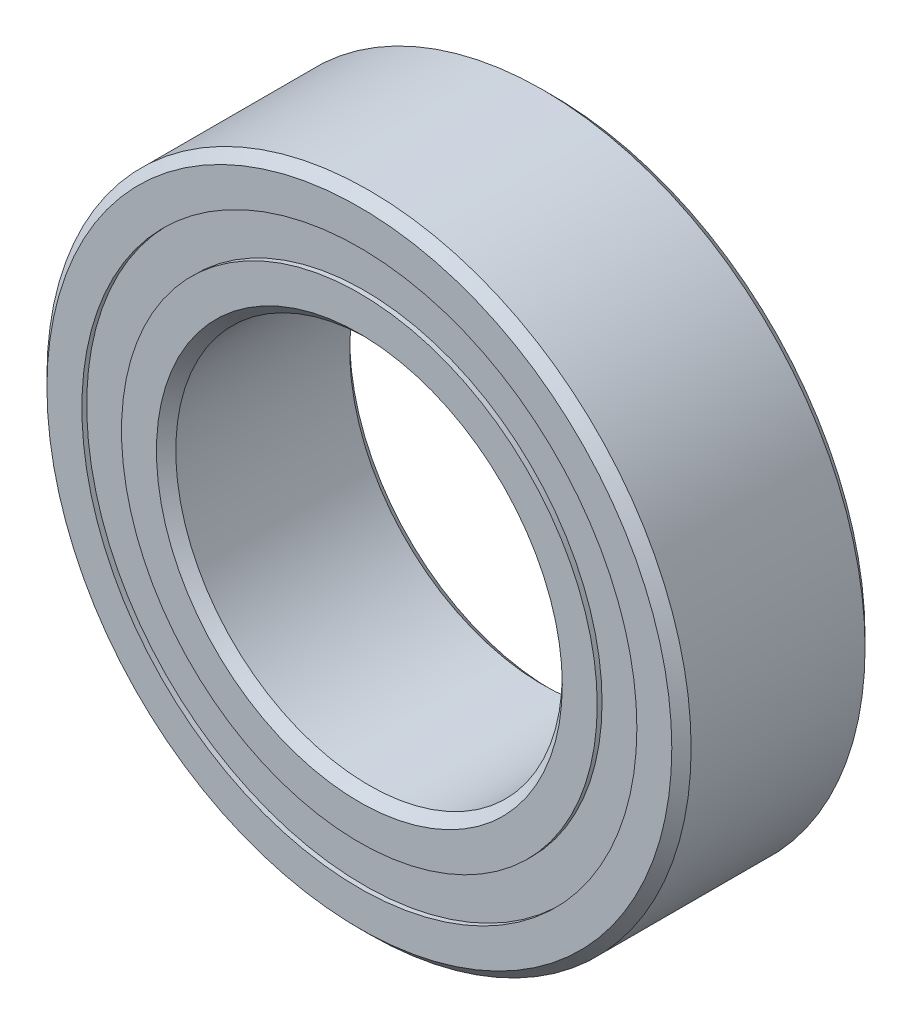
ISO-10303-21;
HEADER;
FILE_DESCRIPTION(('STEP AP214'),'2;1');
FILE_NAME('part.step','',(''),(''),'','','');
FILE_SCHEMA(('AUTOMOTIVE_DESIGN { 1 0 10303 214 1 1 1 1 }'));
ENDSEC;
DATA;
#1=APPLICATION_CONTEXT('core data for automotive mechanical design processes');
#2=APPLICATION_PROTOCOL_DEFINITION('international standard','automotive_design',2000,#1);
#3=PRODUCT_CONTEXT('',#1,'mechanical');
#4=PRODUCT('Part','Part','',(#3));
#5=PRODUCT_RELATED_PRODUCT_CATEGORY('part','',(#4));
#6=PRODUCT_DEFINITION_FORMATION('','',#4);
#7=PRODUCT_DEFINITION_CONTEXT('part definition',#1,'design');
#8=PRODUCT_DEFINITION('design','',#6,#7);
#9=PRODUCT_DEFINITION_SHAPE('','',#8);
#10=(LENGTH_UNIT() NAMED_UNIT(*) SI_UNIT(.MILLI.,.METRE.));
#11=(NAMED_UNIT(*) PLANE_ANGLE_UNIT() SI_UNIT($,.RADIAN.));
#12=(NAMED_UNIT(*) SI_UNIT($,.STERADIAN.) SOLID_ANGLE_UNIT());
#13=UNCERTAINTY_MEASURE_WITH_UNIT(LENGTH_MEASURE(1.E-05),#10,'distance_accuracy_value','');
#14=(GEOMETRIC_REPRESENTATION_CONTEXT(3) GLOBAL_UNCERTAINTY_ASSIGNED_CONTEXT((#13)) GLOBAL_UNIT_ASSIGNED_CONTEXT((#10,
#11,#12)) REPRESENTATION_CONTEXT('',''));
#15=CARTESIAN_POINT('',(0.,0.,0.));
#16=DIRECTION('',(0.,0.,1.));
#17=DIRECTION('',(1.,0.,0.));
#18=AXIS2_PLACEMENT_3D('',#15,#16,#17);
#19=CARTESIAN_POINT('',(0.,4.30769230769231,-1.425));
#20=DIRECTION('',(0.,0.,1.));
#21=DIRECTION('',(1.,0.,0.));
#22=AXIS2_PLACEMENT_3D('',#19,#20,#21);
#23=PLANE('',#22);
#24=CARTESIAN_POINT('',(0.,0.,-1.425));
#25=DIRECTION('',(0.,0.,1.));
#26=DIRECTION('',(1.,0.,0.));
#27=AXIS2_PLACEMENT_3D('',#24,#25,#26);
#28=CIRCLE('',#27,4.30769230769231);
#29=CARTESIAN_POINT('',(4.30769230769231,0.,-1.425));
#30=VERTEX_POINT('',#29);
#31=EDGE_CURVE('E57',#30,#30,#28,.T.);
#32=ORIENTED_EDGE('',*,*,#31,.F.);
#33=EDGE_LOOP('',(#32));
#34=FACE_BOUND('',#33,.T.);
#35=CARTESIAN_POINT('',(0.,0.,-1.425));
#36=DIRECTION('',(0.,0.,1.));
#37=DIRECTION('',(1.,0.,0.));
#38=AXIS2_PLACEMENT_3D('',#35,#36,#37);
#39=CIRCLE('',#38,3.69230769230769);
#40=CARTESIAN_POINT('',(3.69230769230769,0.,-1.425));
#41=VERTEX_POINT('',#40);
#42=EDGE_CURVE('E11',#41,#41,#39,.T.);
#43=ORIENTED_EDGE('',*,*,#42,.T.);
#44=EDGE_LOOP('',(#43));
#45=FACE_BOUND('',#44,.T.);
#46=ADVANCED_FACE('F43',(#34,#45),#23,.F.);
#47=CARTESIAN_POINT('',(0.,0.,1.5));
#48=DIRECTION('',(0.,0.,1.));
#49=DIRECTION('',(1.,0.,0.));
#50=AXIS2_PLACEMENT_3D('',#47,#48,#49);
#51=CYLINDRICAL_SURFACE('',#50,3.69230769230769);
#52=ORIENTED_EDGE('',*,*,#42,.F.);
#53=EDGE_LOOP('',(#52));
#54=FACE_BOUND('',#53,.T.);
#55=CARTESIAN_POINT('',(0.,0.,-0.734247234014172));
#56=DIRECTION('',(0.,0.,1.));
#57=DIRECTION('',(1.,0.,0.));
#58=AXIS2_PLACEMENT_3D('',#55,#56,#57);
#59=CIRCLE('',#58,3.69230769230769);
#60=CARTESIAN_POINT('',(3.69230769230769,0.,-0.734247234014172));
#61=VERTEX_POINT('',#60);
#62=EDGE_CURVE('E49',#61,#61,#59,.T.);
#63=ORIENTED_EDGE('',*,*,#62,.T.);
#64=EDGE_LOOP('',(#63));
#65=FACE_BOUND('',#64,.T.);
#66=ADVANCED_FACE('F66',(#54,#65),#51,.F.);
#67=CARTESIAN_POINT('',(0.,4.30769230769231,-0.734247234014172));
#68=DIRECTION('',(0.,0.,-1.));
#69=DIRECTION('',(-1.,0.,0.));
#70=AXIS2_PLACEMENT_3D('',#67,#68,#69);
#71=PLANE('',#70);
#72=ORIENTED_EDGE('',*,*,#62,.F.);
#73=EDGE_LOOP('',(#72));
#74=FACE_BOUND('',#73,.T.);
#75=CARTESIAN_POINT('',(0.,0.,-0.734247234014172));
#76=DIRECTION('',(0.,0.,1.));
#77=DIRECTION('',(1.,0.,0.));
#78=AXIS2_PLACEMENT_3D('',#75,#76,#77);
#79=CIRCLE('',#78,4.30769230769231);
#80=CARTESIAN_POINT('',(4.30769230769231,0.,-0.734247234014172));
#81=VERTEX_POINT('',#80);
#82=EDGE_CURVE('E53',#81,#81,#79,.T.);
#83=ORIENTED_EDGE('',*,*,#82,.T.);
#84=EDGE_LOOP('',(#83));
#85=FACE_BOUND('',#84,.T.);
#86=ADVANCED_FACE('F70',(#74,#85),#71,.F.);
#87=CARTESIAN_POINT('',(0.,0.,1.5));
#88=DIRECTION('',(0.,0.,1.));
#89=DIRECTION('',(1.,0.,0.));
#90=AXIS2_PLACEMENT_3D('',#87,#88,#89);
#91=CYLINDRICAL_SURFACE('',#90,4.30769230769231);
#92=ORIENTED_EDGE('',*,*,#82,.F.);
#93=EDGE_LOOP('',(#92));
#94=FACE_BOUND('',#93,.T.);
#95=ORIENTED_EDGE('',*,*,#31,.T.);
#96=EDGE_LOOP('',(#95));
#97=FACE_BOUND('',#96,.T.);
#98=ADVANCED_FACE('F63',(#94,#97),#91,.T.);
#99=CLOSED_SHELL('',(#46,#66,#86,#98));
#100=MANIFOLD_SOLID_BREP('B2',#99);
#101=CARTESIAN_POINT('',(0.,4.30769230769231,1.425));
#102=DIRECTION('',(0.,0.,-1.));
#103=DIRECTION('',(-1.,0.,0.));
#104=AXIS2_PLACEMENT_3D('',#101,#102,#103);
#105=PLANE('',#104);
#106=CARTESIAN_POINT('',(0.,0.,1.425));
#107=DIRECTION('',(0.,0.,1.));
#108=DIRECTION('',(1.,0.,0.));
#109=AXIS2_PLACEMENT_3D('',#106,#107,#108);
#110=CIRCLE('',#109,3.69230769230769);
#111=CARTESIAN_POINT('',(3.69230769230769,0.,1.425));
#112=VERTEX_POINT('',#111);
#113=EDGE_CURVE('E42',#112,#112,#110,.T.);
#114=ORIENTED_EDGE('',*,*,#113,.F.);
#115=EDGE_LOOP('',(#114));
#116=FACE_BOUND('',#115,.T.);
#117=CARTESIAN_POINT('',(0.,0.,1.425));
#118=DIRECTION('',(0.,0.,1.));
#119=DIRECTION('',(1.,0.,0.));
#120=AXIS2_PLACEMENT_3D('',#117,#118,#119);
#121=CIRCLE('',#120,4.30769230769231);
#122=CARTESIAN_POINT('',(4.30769230769231,0.,1.425));
#123=VERTEX_POINT('',#122);
#124=EDGE_CURVE('E124',#123,#123,#121,.T.);
#125=ORIENTED_EDGE('',*,*,#124,.T.);
#126=EDGE_LOOP('',(#125));
#127=FACE_BOUND('',#126,.T.);
#128=ADVANCED_FACE('F110',(#116,#127),#105,.F.);
#129=CARTESIAN_POINT('',(0.,0.,1.5));
#130=DIRECTION('',(0.,0.,1.));
#131=DIRECTION('',(1.,0.,0.));
#132=AXIS2_PLACEMENT_3D('',#129,#130,#131);
#133=CYLINDRICAL_SURFACE('',#132,3.69230769230769);
#134=CARTESIAN_POINT('',(0.,0.,0.734247234014171));
#135=DIRECTION('',(0.,0.,1.));
#136=DIRECTION('',(1.,0.,0.));
#137=AXIS2_PLACEMENT_3D('',#134,#135,#136);
#138=CIRCLE('',#137,3.69230769230769);
#139=CARTESIAN_POINT('',(3.69230769230769,0.,0.734247234014171));
#140=VERTEX_POINT('',#139);
#141=EDGE_CURVE('E116',#140,#140,#138,.T.);
#142=ORIENTED_EDGE('',*,*,#141,.F.);
#143=EDGE_LOOP('',(#142));
#144=FACE_BOUND('',#143,.T.);
#145=ORIENTED_EDGE('',*,*,#113,.T.);
#146=EDGE_LOOP('',(#145));
#147=FACE_BOUND('',#146,.T.);
#148=ADVANCED_FACE('F139',(#144,#147),#133,.F.);
#149=CARTESIAN_POINT('',(0.,4.30769230769231,0.734247234014171));
#150=DIRECTION('',(0.,0.,1.));
#151=DIRECTION('',(1.,0.,0.));
#152=AXIS2_PLACEMENT_3D('',#149,#150,#151);
#153=PLANE('',#152);
#154=CARTESIAN_POINT('',(0.,0.,0.734247234014171));
#155=DIRECTION('',(0.,0.,1.));
#156=DIRECTION('',(1.,0.,0.));
#157=AXIS2_PLACEMENT_3D('',#154,#155,#156);
#158=CIRCLE('',#157,4.30769230769231);
#159=CARTESIAN_POINT('',(4.30769230769231,0.,0.734247234014171));
#160=VERTEX_POINT('',#159);
#161=EDGE_CURVE('E120',#160,#160,#158,.T.);
#162=ORIENTED_EDGE('',*,*,#161,.F.);
#163=EDGE_LOOP('',(#162));
#164=FACE_BOUND('',#163,.T.);
#165=ORIENTED_EDGE('',*,*,#141,.T.);
#166=EDGE_LOOP('',(#165));
#167=FACE_BOUND('',#166,.T.);
#168=ADVANCED_FACE('F134',(#164,#167),#153,.F.);
#169=CARTESIAN_POINT('',(0.,0.,1.5));
#170=DIRECTION('',(0.,0.,1.));
#171=DIRECTION('',(1.,0.,0.));
#172=AXIS2_PLACEMENT_3D('',#169,#170,#171);
#173=CYLINDRICAL_SURFACE('',#172,4.30769230769231);
#174=ORIENTED_EDGE('',*,*,#124,.F.);
#175=EDGE_LOOP('',(#174));
#176=FACE_BOUND('',#175,.T.);
#177=ORIENTED_EDGE('',*,*,#161,.T.);
#178=EDGE_LOOP('',(#177));
#179=FACE_BOUND('',#178,.T.);
#180=ADVANCED_FACE('F131',(#176,#179),#173,.T.);
#181=CLOSED_SHELL('',(#128,#148,#168,#180));
#182=MANIFOLD_SOLID_BREP('B6',#181);
#183=CARTESIAN_POINT('',(-1.99999999999996,3.46410161513778,0.));
#184=DIRECTION('',(0.,0.,1.));
#185=DIRECTION('',(-0.499999999999989,0.866025403784445,0.));
#186=AXIS2_PLACEMENT_3D('',#183,#184,#185);
#187=SPHERICAL_SURFACE('',#186,0.734247234014171);
#188=CARTESIAN_POINT('',(-1.99999999999996,3.46410161513778,0.734247234014171));
#189=VERTEX_POINT('',#188);
#190=VERTEX_LOOP('',#189);
#191=FACE_BOUND('',#190,.T.);
#192=ADVANCED_FACE('F177',(#191),#187,.T.);
#193=CLOSED_SHELL('',(#192));
#194=MANIFOLD_SOLID_BREP('B37',#193);
#195=CARTESIAN_POINT('',(-3.46410161513773,2.00000000000004,0.));
#196=DIRECTION('',(0.,0.,1.));
#197=DIRECTION('',(-0.866025403784433,0.50000000000001,0.));
#198=AXIS2_PLACEMENT_3D('',#195,#196,#197);
#199=SPHERICAL_SURFACE('',#198,0.734247234014171);
#200=CARTESIAN_POINT('',(-3.46410161513773,2.00000000000004,0.734247234014171));
#201=VERTEX_POINT('',#200);
#202=VERTEX_LOOP('',#201);
#203=FACE_BOUND('',#202,.T.);
#204=ADVANCED_FACE('F197',(#203),#199,.T.);
#205=CLOSED_SHELL('',(#204));
#206=MANIFOLD_SOLID_BREP('B106',#205);
#207=CARTESIAN_POINT('',(-4.,0.,0.));
#208=DIRECTION('',(0.,0.,1.));
#209=DIRECTION('',(-1.,0.,0.));
#210=AXIS2_PLACEMENT_3D('',#207,#208,#209);
#211=SPHERICAL_SURFACE('',#210,0.734247234014171);
#212=CARTESIAN_POINT('',(-4.,0.,0.734247234014171));
#213=VERTEX_POINT('',#212);
#214=VERTEX_LOOP('',#213);
#215=FACE_BOUND('',#214,.T.);
#216=ADVANCED_FACE('F217',(#215),#211,.T.);
#217=CLOSED_SHELL('',(#216));
#218=MANIFOLD_SOLID_BREP('B173',#217);
#219=CARTESIAN_POINT('',(-3.46410161513777,-1.99999999999997,0.));
#220=DIRECTION('',(0.,0.,1.));
#221=DIRECTION('',(-0.866025403784443,-0.499999999999992,0.));
#222=AXIS2_PLACEMENT_3D('',#219,#220,#221);
#223=SPHERICAL_SURFACE('',#222,0.734247234014171);
#224=CARTESIAN_POINT('',(-3.46410161513777,-1.99999999999997,0.734247234014171));
#225=VERTEX_POINT('',#224);
#226=VERTEX_LOOP('',#225);
#227=FACE_BOUND('',#226,.T.);
#228=ADVANCED_FACE('F237',(#227),#223,.T.);
#229=CLOSED_SHELL('',(#228));
#230=MANIFOLD_SOLID_BREP('B193',#229);
#231=CARTESIAN_POINT('',(-2.00000000000003,-3.46410161513774,0.));
#232=DIRECTION('',(0.,0.,1.));
#233=DIRECTION('',(-0.500000000000007,-0.866025403784435,0.));
#234=AXIS2_PLACEMENT_3D('',#231,#232,#233);
#235=SPHERICAL_SURFACE('',#234,0.734247234014171);
#236=CARTESIAN_POINT('',(-2.00000000000003,-3.46410161513774,0.734247234014171));
#237=VERTEX_POINT('',#236);
#238=VERTEX_LOOP('',#237);
#239=FACE_BOUND('',#238,.T.);
#240=ADVANCED_FACE('F257',(#239),#235,.T.);
#241=CLOSED_SHELL('',(#240));
#242=MANIFOLD_SOLID_BREP('B213',#241);
#243=CARTESIAN_POINT('',(0.,-4.,0.));
#244=DIRECTION('',(0.,0.,1.));
#245=DIRECTION('',(0.,-1.,0.));
#246=AXIS2_PLACEMENT_3D('',#243,#244,#245);
#247=SPHERICAL_SURFACE('',#246,0.734247234014171);
#248=CARTESIAN_POINT('',(0.,-4.,0.734247234014171));
#249=VERTEX_POINT('',#248);
#250=VERTEX_LOOP('',#249);
#251=FACE_BOUND('',#250,.T.);
#252=ADVANCED_FACE('F277',(#251),#247,.T.);
#253=CLOSED_SHELL('',(#252));
#254=MANIFOLD_SOLID_BREP('B233',#253);
#255=CARTESIAN_POINT('',(1.99999999999998,-3.46410161513777,0.));
#256=DIRECTION('',(0.,0.,1.));
#257=DIRECTION('',(0.499999999999995,-0.866025403784442,0.));
#258=AXIS2_PLACEMENT_3D('',#255,#256,#257);
#259=SPHERICAL_SURFACE('',#258,0.734247234014171);
#260=CARTESIAN_POINT('',(1.99999999999998,-3.46410161513777,0.734247234014171));
#261=VERTEX_POINT('',#260);
#262=VERTEX_LOOP('',#261);
#263=FACE_BOUND('',#262,.T.);
#264=ADVANCED_FACE('F297',(#263),#259,.T.);
#265=CLOSED_SHELL('',(#264));
#266=MANIFOLD_SOLID_BREP('B253',#265);
#267=CARTESIAN_POINT('',(3.46410161513775,-2.00000000000002,0.));
#268=DIRECTION('',(0.,0.,1.));
#269=DIRECTION('',(0.866025403784436,-0.500000000000004,0.));
#270=AXIS2_PLACEMENT_3D('',#267,#268,#269);
#271=SPHERICAL_SURFACE('',#270,0.734247234014171);
#272=CARTESIAN_POINT('',(3.46410161513775,-2.00000000000002,0.734247234014171));
#273=VERTEX_POINT('',#272);
#274=VERTEX_LOOP('',#273);
#275=FACE_BOUND('',#274,.T.);
#276=ADVANCED_FACE('F317',(#275),#271,.T.);
#277=CLOSED_SHELL('',(#276));
#278=MANIFOLD_SOLID_BREP('B273',#277);
#279=CARTESIAN_POINT('',(4.,0.,0.));
#280=DIRECTION('',(0.,0.,1.));
#281=DIRECTION('',(1.,0.,0.));
#282=AXIS2_PLACEMENT_3D('',#279,#280,#281);
#283=SPHERICAL_SURFACE('',#282,0.734247234014171);
#284=CARTESIAN_POINT('',(4.,0.,0.734247234014171));
#285=VERTEX_POINT('',#284);
#286=VERTEX_LOOP('',#285);
#287=FACE_BOUND('',#286,.T.);
#288=ADVANCED_FACE('F337',(#287),#283,.T.);
#289=CLOSED_SHELL('',(#288));
#290=MANIFOLD_SOLID_BREP('B293',#289);
#291=CARTESIAN_POINT('',(3.46410161513776,1.99999999999999,0.));
#292=DIRECTION('',(0.,0.,1.));
#293=DIRECTION('',(0.86602540378444,0.499999999999998,0.));
#294=AXIS2_PLACEMENT_3D('',#291,#292,#293);
#295=SPHERICAL_SURFACE('',#294,0.734247234014171);
#296=CARTESIAN_POINT('',(3.46410161513776,1.99999999999999,0.734247234014171));
#297=VERTEX_POINT('',#296);
#298=VERTEX_LOOP('',#297);
#299=FACE_BOUND('',#298,.T.);
#300=ADVANCED_FACE('F357',(#299),#295,.T.);
#301=CLOSED_SHELL('',(#300));
#302=MANIFOLD_SOLID_BREP('B313',#301);
#303=CARTESIAN_POINT('',(2.,3.46410161513775,0.));
#304=DIRECTION('',(0.,0.,1.));
#305=DIRECTION('',(0.500000000000001,0.866025403784438,0.));
#306=AXIS2_PLACEMENT_3D('',#303,#304,#305);
#307=SPHERICAL_SURFACE('',#306,0.734247234014171);
#308=CARTESIAN_POINT('',(2.,3.46410161513775,0.734247234014171));
#309=VERTEX_POINT('',#308);
#310=VERTEX_LOOP('',#309);
#311=FACE_BOUND('',#310,.T.);
#312=ADVANCED_FACE('F377',(#311),#307,.T.);
#313=CLOSED_SHELL('',(#312));
#314=MANIFOLD_SOLID_BREP('B333',#313);
#315=CARTESIAN_POINT('',(0.,4.,0.));
#316=DIRECTION('',(0.,0.,1.));
#317=DIRECTION('',(0.,1.,0.));
#318=AXIS2_PLACEMENT_3D('',#315,#316,#317);
#319=SPHERICAL_SURFACE('',#318,0.734247234014171);
#320=CARTESIAN_POINT('',(0.,4.,0.734247234014171));
#321=VERTEX_POINT('',#320);
#322=VERTEX_LOOP('',#321);
#323=FACE_BOUND('',#322,.T.);
#324=ADVANCED_FACE('F399',(#323),#319,.T.);
#325=CLOSED_SHELL('',(#324));
#326=MANIFOLD_SOLID_BREP('B353',#325);
#327=CARTESIAN_POINT('',(0.,3.69230769230769,1.5));
#328=DIRECTION('',(0.,0.,-1.));
#329=DIRECTION('',(-1.,0.,0.));
#330=AXIS2_PLACEMENT_3D('',#327,#328,#329);
#331=PLANE('',#330);
#332=CARTESIAN_POINT('',(0.,0.,1.5));
#333=DIRECTION('',(0.,0.,1.));
#334=DIRECTION('',(1.,0.,0.));
#335=AXIS2_PLACEMENT_3D('',#332,#333,#334);
#336=CIRCLE('',#335,3.15);
#337=CARTESIAN_POINT('',(3.15,0.,1.5));
#338=VERTEX_POINT('',#337);
#339=EDGE_CURVE('E446',#338,#338,#336,.T.);
#340=ORIENTED_EDGE('',*,*,#339,.F.);
#341=EDGE_LOOP('',(#340));
#342=FACE_BOUND('',#341,.T.);
#343=CARTESIAN_POINT('',(0.,0.,1.5));
#344=DIRECTION('',(0.,0.,1.));
#345=DIRECTION('',(1.,0.,0.));
#346=AXIS2_PLACEMENT_3D('',#343,#344,#345);
#347=CIRCLE('',#346,3.69230769230769);
#348=CARTESIAN_POINT('',(3.69230769230769,0.,1.5));
#349=VERTEX_POINT('',#348);
#350=EDGE_CURVE('E398',#349,#349,#347,.T.);
#351=ORIENTED_EDGE('',*,*,#350,.T.);
#352=EDGE_LOOP('',(#351));
#353=FACE_BOUND('',#352,.T.);
#354=ADVANCED_FACE('F418',(#342,#353),#331,.F.);
#355=CARTESIAN_POINT('',(0.,0.,1.5));
#356=DIRECTION('',(0.,0.,1.));
#357=DIRECTION('',(1.,0.,0.));
#358=AXIS2_PLACEMENT_3D('',#355,#356,#357);
#359=CYLINDRICAL_SURFACE('',#358,3.69230769230769);
#360=ORIENTED_EDGE('',*,*,#350,.F.);
#361=EDGE_LOOP('',(#360));
#362=FACE_BOUND('',#361,.T.);
#363=CARTESIAN_POINT('',(0.,0.,0.666666666666667));
#364=DIRECTION('',(0.,0.,1.));
#365=DIRECTION('',(1.,0.,0.));
#366=AXIS2_PLACEMENT_3D('',#363,#364,#365);
#367=CIRCLE('',#366,3.69230769230769);
#368=CARTESIAN_POINT('',(3.69230769230769,0.,0.666666666666667));
#369=VERTEX_POINT('',#368);
#370=EDGE_CURVE('E424',#369,#369,#367,.T.);
#371=ORIENTED_EDGE('',*,*,#370,.T.);
#372=EDGE_LOOP('',(#371));
#373=FACE_BOUND('',#372,.T.);
#374=ADVANCED_FACE('F453',(#362,#373),#359,.T.);
#375=CARTESIAN_POINT('',(0.,0.,0.));
#376=DIRECTION('',(0.,0.,1.));
#377=DIRECTION('',(1.,0.,0.));
#378=AXIS2_PLACEMENT_3D('',#375,#376,#377);
#379=TOROIDAL_SURFACE('',#378,4.,0.73424723401417);
#380=ORIENTED_EDGE('',*,*,#370,.F.);
#381=EDGE_LOOP('',(#380));
#382=FACE_BOUND('',#381,.T.);
#383=CARTESIAN_POINT('',(0.,0.,-0.666666666666668));
#384=DIRECTION('',(0.,0.,1.));
#385=DIRECTION('',(1.,0.,0.));
#386=AXIS2_PLACEMENT_3D('',#383,#384,#385);
#387=CIRCLE('',#386,3.69230769230769);
#388=CARTESIAN_POINT('',(3.69230769230769,0.,-0.666666666666668));
#389=VERTEX_POINT('',#388);
#390=EDGE_CURVE('E428',#389,#389,#387,.T.);
#391=ORIENTED_EDGE('',*,*,#390,.T.);
#392=EDGE_LOOP('',(#391));
#393=FACE_BOUND('',#392,.T.);
#394=ADVANCED_FACE('F457',(#382,#393),#379,.F.);
#395=CARTESIAN_POINT('',(0.,0.,1.5));
#396=DIRECTION('',(0.,0.,1.));
#397=DIRECTION('',(1.,0.,0.));
#398=AXIS2_PLACEMENT_3D('',#395,#396,#397);
#399=CYLINDRICAL_SURFACE('',#398,3.69230769230769);
#400=ORIENTED_EDGE('',*,*,#390,.F.);
#401=EDGE_LOOP('',(#400));
#402=FACE_BOUND('',#401,.T.);
#403=CARTESIAN_POINT('',(0.,0.,-1.5));
#404=DIRECTION('',(0.,0.,1.));
#405=DIRECTION('',(1.,0.,0.));
#406=AXIS2_PLACEMENT_3D('',#403,#404,#405);
#407=CIRCLE('',#406,3.69230769230769);
#408=CARTESIAN_POINT('',(3.69230769230769,0.,-1.5));
#409=VERTEX_POINT('',#408);
#410=EDGE_CURVE('E432',#409,#409,#407,.T.);
#411=ORIENTED_EDGE('',*,*,#410,.T.);
#412=EDGE_LOOP('',(#411));
#413=FACE_BOUND('',#412,.T.);
#414=ADVANCED_FACE('F462',(#402,#413),#399,.T.);
#415=CARTESIAN_POINT('',(0.,3.15,-1.5));
#416=DIRECTION('',(0.,0.,1.));
#417=DIRECTION('',(1.,0.,0.));
#418=AXIS2_PLACEMENT_3D('',#415,#416,#417);
#419=PLANE('',#418);
#420=ORIENTED_EDGE('',*,*,#410,.F.);
#421=EDGE_LOOP('',(#420));
#422=FACE_BOUND('',#421,.T.);
#423=CARTESIAN_POINT('',(0.,0.,-1.5));
#424=DIRECTION('',(0.,0.,1.));
#425=DIRECTION('',(1.,0.,0.));
#426=AXIS2_PLACEMENT_3D('',#423,#424,#425);
#427=CIRCLE('',#426,3.15);
#428=CARTESIAN_POINT('',(3.15,0.,-1.5));
#429=VERTEX_POINT('',#428);
#430=EDGE_CURVE('E437',#429,#429,#427,.T.);
#431=ORIENTED_EDGE('',*,*,#430,.T.);
#432=EDGE_LOOP('',(#431));
#433=FACE_BOUND('',#432,.T.);
#434=ADVANCED_FACE('F468',(#422,#433),#419,.F.);
#435=CARTESIAN_POINT('',(0.,0.,-1.35));
#436=DIRECTION('',(0.,0.,-1.));
#437=DIRECTION('',(-1.,0.,0.));
#438=AXIS2_PLACEMENT_3D('',#435,#436,#437);
#439=CONICAL_SURFACE('',#438,3.,0.785398163397445);
#440=ORIENTED_EDGE('',*,*,#430,.F.);
#441=EDGE_LOOP('',(#440));
#442=FACE_BOUND('',#441,.T.);
#443=CARTESIAN_POINT('',(0.,0.,-1.35));
#444=DIRECTION('',(0.,0.,1.));
#445=DIRECTION('',(1.,0.,0.));
#446=AXIS2_PLACEMENT_3D('',#443,#444,#445);
#447=CIRCLE('',#446,3.);
#448=CARTESIAN_POINT('',(3.,0.,-1.35));
#449=VERTEX_POINT('',#448);
#450=EDGE_CURVE('E440',#449,#449,#447,.T.);
#451=ORIENTED_EDGE('',*,*,#450,.T.);
#452=EDGE_LOOP('',(#451));
#453=FACE_BOUND('',#452,.T.);
#454=ADVANCED_FACE('F472',(#442,#453),#439,.F.);
#455=CARTESIAN_POINT('',(0.,0.,1.5));
#456=DIRECTION('',(0.,0.,1.));
#457=DIRECTION('',(1.,0.,0.));
#458=AXIS2_PLACEMENT_3D('',#455,#456,#457);
#459=CYLINDRICAL_SURFACE('',#458,3.);
#460=ORIENTED_EDGE('',*,*,#450,.F.);
#461=EDGE_LOOP('',(#460));
#462=FACE_BOUND('',#461,.T.);
#463=CARTESIAN_POINT('',(0.,0.,1.35));
#464=DIRECTION('',(0.,0.,1.));
#465=DIRECTION('',(1.,0.,0.));
#466=AXIS2_PLACEMENT_3D('',#463,#464,#465);
#467=CIRCLE('',#466,3.);
#468=CARTESIAN_POINT('',(3.,0.,1.35));
#469=VERTEX_POINT('',#468);
#470=EDGE_CURVE('E443',#469,#469,#467,.T.);
#471=ORIENTED_EDGE('',*,*,#470,.T.);
#472=EDGE_LOOP('',(#471));
#473=FACE_BOUND('',#472,.T.);
#474=ADVANCED_FACE('F476',(#462,#473),#459,.F.);
#475=CARTESIAN_POINT('',(0.,0.,1.5));
#476=DIRECTION('',(0.,0.,1.));
#477=DIRECTION('',(1.,0.,0.));
#478=AXIS2_PLACEMENT_3D('',#475,#476,#477);
#479=CONICAL_SURFACE('',#478,3.15,0.785398163397451);
#480=ORIENTED_EDGE('',*,*,#470,.F.);
#481=EDGE_LOOP('',(#480));
#482=FACE_BOUND('',#481,.T.);
#483=ORIENTED_EDGE('',*,*,#339,.T.);
#484=EDGE_LOOP('',(#483));
#485=FACE_BOUND('',#484,.T.);
#486=ADVANCED_FACE('F450',(#482,#485),#479,.F.);
#487=CLOSED_SHELL('',(#354,#374,#394,#414,#434,#454,#474,#486));
#488=MANIFOLD_SOLID_BREP('B373',#487);
#489=CARTESIAN_POINT('',(0.,0.,1.35));
#490=DIRECTION('',(0.,0.,-1.));
#491=DIRECTION('',(-1.,0.,0.));
#492=AXIS2_PLACEMENT_3D('',#489,#490,#491);
#493=CONICAL_SURFACE('',#492,5.,0.785398163397445);
#494=CARTESIAN_POINT('',(0.,0.,1.5));
#495=DIRECTION('',(0.,0.,1.));
#496=DIRECTION('',(1.,0.,0.));
#497=AXIS2_PLACEMENT_3D('',#494,#495,#496);
#498=CIRCLE('',#497,4.85);
#499=CARTESIAN_POINT('',(4.85,0.,1.5));
#500=VERTEX_POINT('',#499);
#501=EDGE_CURVE('E567',#500,#500,#498,.T.);
#502=ORIENTED_EDGE('',*,*,#501,.F.);
#503=EDGE_LOOP('',(#502));
#504=FACE_BOUND('',#503,.T.);
#505=CARTESIAN_POINT('',(0.,0.,1.35));
#506=DIRECTION('',(0.,0.,1.));
#507=DIRECTION('',(1.,0.,0.));
#508=AXIS2_PLACEMENT_3D('',#505,#506,#507);
#509=CIRCLE('',#508,5.);
#510=CARTESIAN_POINT('',(5.,0.,1.35));
#511=VERTEX_POINT('',#510);
#512=EDGE_CURVE('E417',#511,#511,#509,.T.);
#513=ORIENTED_EDGE('',*,*,#512,.T.);
#514=EDGE_LOOP('',(#513));
#515=FACE_BOUND('',#514,.T.);
#516=ADVANCED_FACE('F539',(#504,#515),#493,.T.);
#517=CARTESIAN_POINT('',(0.,0.,1.5));
#518=DIRECTION('',(0.,0.,1.));
#519=DIRECTION('',(1.,0.,0.));
#520=AXIS2_PLACEMENT_3D('',#517,#518,#519);
#521=CYLINDRICAL_SURFACE('',#520,5.);
#522=ORIENTED_EDGE('',*,*,#512,.F.);
#523=EDGE_LOOP('',(#522));
#524=FACE_BOUND('',#523,.T.);
#525=CARTESIAN_POINT('',(0.,0.,-1.35));
#526=DIRECTION('',(0.,0.,1.));
#527=DIRECTION('',(1.,0.,0.));
#528=AXIS2_PLACEMENT_3D('',#525,#526,#527);
#529=CIRCLE('',#528,5.);
#530=CARTESIAN_POINT('',(5.,0.,-1.35));
#531=VERTEX_POINT('',#530);
#532=EDGE_CURVE('E545',#531,#531,#529,.T.);
#533=ORIENTED_EDGE('',*,*,#532,.T.);
#534=EDGE_LOOP('',(#533));
#535=FACE_BOUND('',#534,.T.);
#536=ADVANCED_FACE('F574',(#524,#535),#521,.T.);
#537=CARTESIAN_POINT('',(0.,0.,-1.5));
#538=DIRECTION('',(0.,0.,1.));
#539=DIRECTION('',(1.,0.,0.));
#540=AXIS2_PLACEMENT_3D('',#537,#538,#539);
#541=CONICAL_SURFACE('',#540,4.85,0.785398163397445);
#542=ORIENTED_EDGE('',*,*,#532,.F.);
#543=EDGE_LOOP('',(#542));
#544=FACE_BOUND('',#543,.T.);
#545=CARTESIAN_POINT('',(0.,0.,-1.5));
#546=DIRECTION('',(0.,0.,1.));
#547=DIRECTION('',(1.,0.,0.));
#548=AXIS2_PLACEMENT_3D('',#545,#546,#547);
#549=CIRCLE('',#548,4.85);
#550=CARTESIAN_POINT('',(4.85,0.,-1.5));
#551=VERTEX_POINT('',#550);
#552=EDGE_CURVE('E549',#551,#551,#549,.T.);
#553=ORIENTED_EDGE('',*,*,#552,.T.);
#554=EDGE_LOOP('',(#553));
#555=FACE_BOUND('',#554,.T.);
#556=ADVANCED_FACE('F578',(#544,#555),#541,.T.);
#557=CARTESIAN_POINT('',(0.,4.85,-1.5));
#558=DIRECTION('',(0.,0.,1.));
#559=DIRECTION('',(1.,0.,0.));
#560=AXIS2_PLACEMENT_3D('',#557,#558,#559);
#561=PLANE('',#560);
#562=ORIENTED_EDGE('',*,*,#552,.F.);
#563=EDGE_LOOP('',(#562));
#564=FACE_BOUND('',#563,.T.);
#565=CARTESIAN_POINT('',(0.,0.,-1.5));
#566=DIRECTION('',(0.,0.,1.));
#567=DIRECTION('',(1.,0.,0.));
#568=AXIS2_PLACEMENT_3D('',#565,#566,#567);
#569=CIRCLE('',#568,4.30769230769231);
#570=CARTESIAN_POINT('',(4.30769230769231,0.,-1.5));
#571=VERTEX_POINT('',#570);
#572=EDGE_CURVE('E553',#571,#571,#569,.T.);
#573=ORIENTED_EDGE('',*,*,#572,.T.);
#574=EDGE_LOOP('',(#573));
#575=FACE_BOUND('',#574,.T.);
#576=ADVANCED_FACE('F583',(#564,#575),#561,.F.);
#577=CARTESIAN_POINT('',(0.,0.,1.5));
#578=DIRECTION('',(0.,0.,1.));
#579=DIRECTION('',(1.,0.,0.));
#580=AXIS2_PLACEMENT_3D('',#577,#578,#579);
#581=CYLINDRICAL_SURFACE('',#580,4.30769230769231);
#582=ORIENTED_EDGE('',*,*,#572,.F.);
#583=EDGE_LOOP('',(#582));
#584=FACE_BOUND('',#583,.T.);
#585=CARTESIAN_POINT('',(0.,0.,-0.666666666666667));
#586=DIRECTION('',(0.,0.,1.));
#587=DIRECTION('',(1.,0.,0.));
#588=AXIS2_PLACEMENT_3D('',#585,#586,#587);
#589=CIRCLE('',#588,4.30769230769231);
#590=CARTESIAN_POINT('',(4.30769230769231,0.,-0.666666666666667));
#591=VERTEX_POINT('',#590);
#592=EDGE_CURVE('E558',#591,#591,#589,.T.);
#593=ORIENTED_EDGE('',*,*,#592,.T.);
#594=EDGE_LOOP('',(#593));
#595=FACE_BOUND('',#594,.T.);
#596=ADVANCED_FACE('F589',(#584,#595),#581,.F.);
#597=CARTESIAN_POINT('',(0.,0.,0.));
#598=DIRECTION('',(0.,0.,1.));
#599=DIRECTION('',(1.,0.,0.));
#600=AXIS2_PLACEMENT_3D('',#597,#598,#599);
#601=TOROIDAL_SURFACE('',#600,4.,0.734247234014171);
#602=ORIENTED_EDGE('',*,*,#592,.F.);
#603=EDGE_LOOP('',(#602));
#604=FACE_BOUND('',#603,.T.);
#605=CARTESIAN_POINT('',(0.,0.,0.666666666666667));
#606=DIRECTION('',(0.,0.,1.));
#607=DIRECTION('',(1.,0.,0.));
#608=AXIS2_PLACEMENT_3D('',#605,#606,#607);
#609=CIRCLE('',#608,4.30769230769231);
#610=CARTESIAN_POINT('',(4.30769230769231,0.,0.666666666666667));
#611=VERTEX_POINT('',#610);
#612=EDGE_CURVE('E561',#611,#611,#609,.T.);
#613=ORIENTED_EDGE('',*,*,#612,.T.);
#614=EDGE_LOOP('',(#613));
#615=FACE_BOUND('',#614,.T.);
#616=ADVANCED_FACE('F593',(#604,#615),#601,.F.);
#617=CARTESIAN_POINT('',(0.,0.,1.5));
#618=DIRECTION('',(0.,0.,1.));
#619=DIRECTION('',(1.,0.,0.));
#620=AXIS2_PLACEMENT_3D('',#617,#618,#619);
#621=CYLINDRICAL_SURFACE('',#620,4.30769230769231);
#622=ORIENTED_EDGE('',*,*,#612,.F.);
#623=EDGE_LOOP('',(#622));
#624=FACE_BOUND('',#623,.T.);
#625=CARTESIAN_POINT('',(0.,0.,1.5));
#626=DIRECTION('',(0.,0.,1.));
#627=DIRECTION('',(1.,0.,0.));
#628=AXIS2_PLACEMENT_3D('',#625,#626,#627);
#629=CIRCLE('',#628,4.30769230769231);
#630=CARTESIAN_POINT('',(4.30769230769231,0.,1.5));
#631=VERTEX_POINT('',#630);
#632=EDGE_CURVE('E564',#631,#631,#629,.T.);
#633=ORIENTED_EDGE('',*,*,#632,.T.);
#634=EDGE_LOOP('',(#633));
#635=FACE_BOUND('',#634,.T.);
#636=ADVANCED_FACE('F597',(#624,#635),#621,.F.);
#637=CARTESIAN_POINT('',(0.,4.85,1.5));
#638=DIRECTION('',(0.,0.,-1.));
#639=DIRECTION('',(-1.,0.,0.));
#640=AXIS2_PLACEMENT_3D('',#637,#638,#639);
#641=PLANE('',#640);
#642=ORIENTED_EDGE('',*,*,#632,.F.);
#643=EDGE_LOOP('',(#642));
#644=FACE_BOUND('',#643,.T.);
#645=ORIENTED_EDGE('',*,*,#501,.T.);
#646=EDGE_LOOP('',(#645));
#647=FACE_BOUND('',#646,.T.);
#648=ADVANCED_FACE('F571',(#644,#647),#641,.F.);
#649=CLOSED_SHELL('',(#516,#536,#556,#576,#596,#616,#636,#648));
#650=MANIFOLD_SOLID_BREP('B393',#649);
#651=ADVANCED_BREP_SHAPE_REPRESENTATION('',(#18,#100,#182,#194,#206,#218,#230,#242,#254,#266,
#278,#290,#302,#314,#326,#488,#650),#14);
#652=SHAPE_DEFINITION_REPRESENTATION(#9,#651);
ENDSEC;
END-ISO-10303-21;
